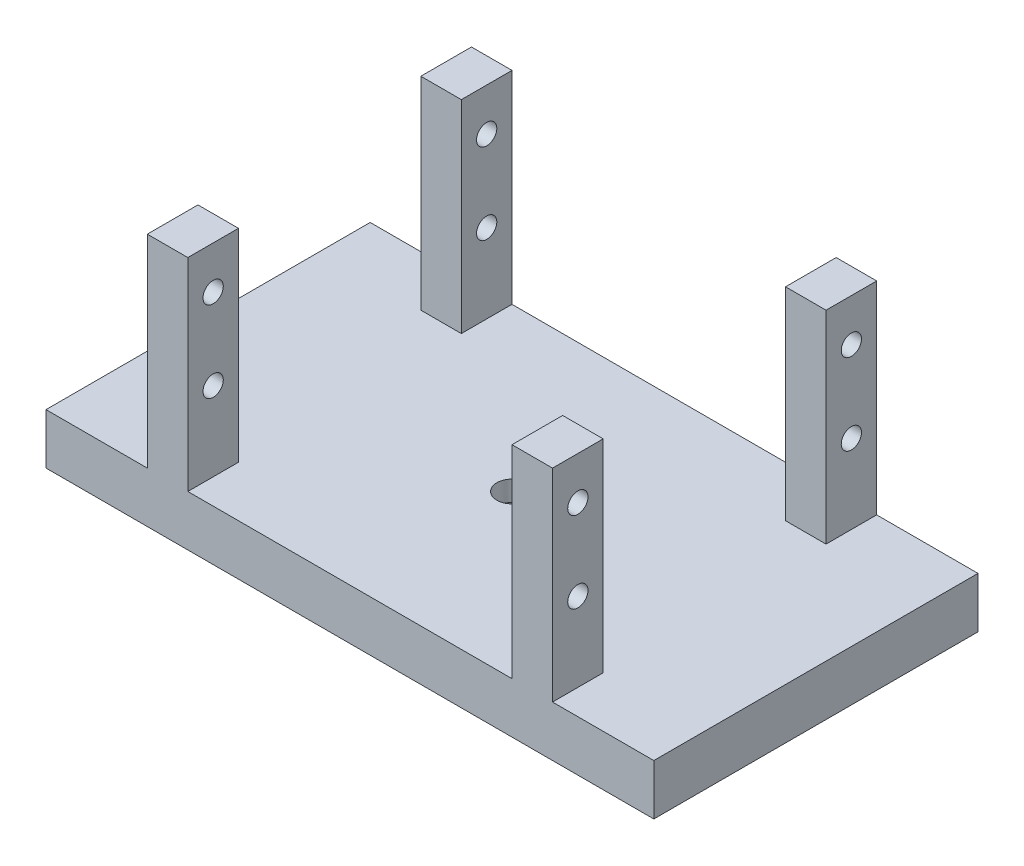
ISO-10303-21;
HEADER;
FILE_DESCRIPTION(('STEP AP214'),'2;1');
FILE_NAME('part.step','',(''),(''),'','','');
FILE_SCHEMA(('AUTOMOTIVE_DESIGN { 1 0 10303 214 1 1 1 1 }'));
ENDSEC;
DATA;
#1=APPLICATION_CONTEXT('core data for automotive mechanical design processes');
#2=APPLICATION_PROTOCOL_DEFINITION('international standard','automotive_design',2000,#1);
#3=PRODUCT_CONTEXT('',#1,'mechanical');
#4=PRODUCT('Part','Part','',(#3));
#5=PRODUCT_RELATED_PRODUCT_CATEGORY('part','',(#4));
#6=PRODUCT_DEFINITION_FORMATION('','',#4);
#7=PRODUCT_DEFINITION_CONTEXT('part definition',#1,'design');
#8=PRODUCT_DEFINITION('design','',#6,#7);
#9=PRODUCT_DEFINITION_SHAPE('','',#8);
#10=(LENGTH_UNIT() NAMED_UNIT(*) SI_UNIT(.MILLI.,.METRE.));
#11=(NAMED_UNIT(*) PLANE_ANGLE_UNIT() SI_UNIT($,.RADIAN.));
#12=(NAMED_UNIT(*) SI_UNIT($,.STERADIAN.) SOLID_ANGLE_UNIT());
#13=UNCERTAINTY_MEASURE_WITH_UNIT(LENGTH_MEASURE(1.E-05),#10,'distance_accuracy_value','');
#14=(GEOMETRIC_REPRESENTATION_CONTEXT(3) GLOBAL_UNCERTAINTY_ASSIGNED_CONTEXT((#13)) GLOBAL_UNIT_ASSIGNED_CONTEXT((#10,
#11,#12)) REPRESENTATION_CONTEXT('',''));
#15=CARTESIAN_POINT('',(0.,0.,0.));
#16=DIRECTION('',(0.,0.,1.));
#17=DIRECTION('',(1.,0.,0.));
#18=AXIS2_PLACEMENT_3D('',#15,#16,#17);
#19=CARTESIAN_POINT('',(-16.,25.,-16.));
#20=DIRECTION('',(-1.,0.,0.));
#21=DIRECTION('',(0.,0.,1.));
#22=AXIS2_PLACEMENT_3D('',#19,#20,#21);
#23=PLANE('',#22);
#24=CARTESIAN_POINT('',(-16.,20.8,13.5));
#25=DIRECTION('',(-1.,0.,0.));
#26=DIRECTION('',(0.,0.,1.));
#27=AXIS2_PLACEMENT_3D('',#24,#25,#26);
#28=CIRCLE('',#27,1.);
#29=CARTESIAN_POINT('',(-16.,20.8,14.5));
#30=VERTEX_POINT('',#29);
#31=EDGE_CURVE('E322',#30,#30,#28,.T.);
#32=ORIENTED_EDGE('',*,*,#31,.T.);
#33=EDGE_LOOP('',(#32));
#34=FACE_BOUND('',#33,.T.);
#35=CARTESIAN_POINT('',(-16.,12.8,13.5));
#36=DIRECTION('',(-1.,0.,0.));
#37=DIRECTION('',(0.,0.,1.));
#38=AXIS2_PLACEMENT_3D('',#35,#36,#37);
#39=CIRCLE('',#38,1.);
#40=CARTESIAN_POINT('',(-16.,12.8,14.5));
#41=VERTEX_POINT('',#40);
#42=EDGE_CURVE('E316',#41,#41,#39,.T.);
#43=ORIENTED_EDGE('',*,*,#42,.T.);
#44=EDGE_LOOP('',(#43));
#45=FACE_BOUND('',#44,.T.);
#46=DIRECTION('',(0.,0.,-1.));
#47=VECTOR('',#46,1.);
#48=CARTESIAN_POINT('',(-16.,5.,-16.));
#49=LINE('',#48,#47);
#50=CARTESIAN_POINT('',(-16.,5.,16.));
#51=VERTEX_POINT('',#50);
#52=CARTESIAN_POINT('',(-16.,5.,11.));
#53=VERTEX_POINT('',#52);
#54=EDGE_CURVE('E213',#51,#53,#49,.T.);
#55=ORIENTED_EDGE('',*,*,#54,.T.);
#56=DIRECTION('',(0.,1.,0.));
#57=VECTOR('',#56,1.);
#58=CARTESIAN_POINT('',(-16.,25.,11.));
#59=LINE('',#58,#57);
#60=CARTESIAN_POINT('',(-16.,25.,11.));
#61=VERTEX_POINT('',#60);
#62=EDGE_CURVE('E188',#53,#61,#59,.T.);
#63=ORIENTED_EDGE('',*,*,#62,.T.);
#64=DIRECTION('',(0.,0.,-1.));
#65=VECTOR('',#64,1.);
#66=CARTESIAN_POINT('',(-16.,25.,-16.));
#67=LINE('',#66,#65);
#68=CARTESIAN_POINT('',(-16.,25.,16.));
#69=VERTEX_POINT('',#68);
#70=EDGE_CURVE('E386',#69,#61,#67,.T.);
#71=ORIENTED_EDGE('',*,*,#70,.F.);
#72=DIRECTION('',(0.,-1.,0.));
#73=VECTOR('',#72,1.);
#74=CARTESIAN_POINT('',(-16.,25.,16.));
#75=LINE('',#74,#73);
#76=EDGE_CURVE('E223',#69,#51,#75,.T.);
#77=ORIENTED_EDGE('',*,*,#76,.T.);
#78=EDGE_LOOP('',(#55,#63,#71,#77));
#79=FACE_BOUND('',#78,.T.);
#80=ADVANCED_FACE('F43',(#34,#45,#79),#23,.F.);
#81=CARTESIAN_POINT('',(-20.,25.,-16.));
#82=DIRECTION('',(1.,0.,0.));
#83=DIRECTION('',(0.,0.,-1.));
#84=AXIS2_PLACEMENT_3D('',#81,#82,#83);
#85=PLANE('',#84);
#86=CARTESIAN_POINT('',(-20.,20.8,13.5));
#87=DIRECTION('',(-1.,0.,0.));
#88=DIRECTION('',(0.,0.,1.));
#89=AXIS2_PLACEMENT_3D('',#86,#87,#88);
#90=CIRCLE('',#89,1.);
#91=CARTESIAN_POINT('',(-20.,20.8,14.5));
#92=VERTEX_POINT('',#91);
#93=EDGE_CURVE('E593',#92,#92,#90,.T.);
#94=ORIENTED_EDGE('',*,*,#93,.F.);
#95=EDGE_LOOP('',(#94));
#96=FACE_BOUND('',#95,.T.);
#97=CARTESIAN_POINT('',(-20.,12.8,13.5));
#98=DIRECTION('',(-1.,0.,0.));
#99=DIRECTION('',(0.,0.,1.));
#100=AXIS2_PLACEMENT_3D('',#97,#98,#99);
#101=CIRCLE('',#100,1.);
#102=CARTESIAN_POINT('',(-20.,12.8,14.5));
#103=VERTEX_POINT('',#102);
#104=EDGE_CURVE('E203',#103,#103,#101,.T.);
#105=ORIENTED_EDGE('',*,*,#104,.F.);
#106=EDGE_LOOP('',(#105));
#107=FACE_BOUND('',#106,.T.);
#108=DIRECTION('',(0.,0.,1.));
#109=VECTOR('',#108,1.);
#110=CARTESIAN_POINT('',(-20.,25.,-16.));
#111=LINE('',#110,#109);
#112=CARTESIAN_POINT('',(-20.,25.,11.));
#113=VERTEX_POINT('',#112);
#114=CARTESIAN_POINT('',(-20.,25.,16.));
#115=VERTEX_POINT('',#114);
#116=EDGE_CURVE('E201',#113,#115,#111,.T.);
#117=ORIENTED_EDGE('',*,*,#116,.F.);
#118=DIRECTION('',(0.,1.,0.));
#119=VECTOR('',#118,1.);
#120=CARTESIAN_POINT('',(-20.,25.,11.));
#121=LINE('',#120,#119);
#122=CARTESIAN_POINT('',(-20.,5.,11.));
#123=VERTEX_POINT('',#122);
#124=EDGE_CURVE('E185',#123,#113,#121,.T.);
#125=ORIENTED_EDGE('',*,*,#124,.F.);
#126=DIRECTION('',(0.,0.,1.));
#127=VECTOR('',#126,1.);
#128=CARTESIAN_POINT('',(-20.,5.,-16.));
#129=LINE('',#128,#127);
#130=CARTESIAN_POINT('',(-20.,5.,16.));
#131=VERTEX_POINT('',#130);
#132=EDGE_CURVE('E199',#123,#131,#129,.T.);
#133=ORIENTED_EDGE('',*,*,#132,.T.);
#134=DIRECTION('',(0.,-1.,0.));
#135=VECTOR('',#134,1.);
#136=CARTESIAN_POINT('',(-20.,25.,16.));
#137=LINE('',#136,#135);
#138=EDGE_CURVE('E227',#115,#131,#137,.T.);
#139=ORIENTED_EDGE('',*,*,#138,.F.);
#140=EDGE_LOOP('',(#117,#125,#133,#139));
#141=FACE_BOUND('',#140,.T.);
#142=ADVANCED_FACE('F197',(#96,#107,#141),#85,.F.);
#143=CARTESIAN_POINT('',(0.,25.,0.));
#144=DIRECTION('',(0.,1.,0.));
#145=DIRECTION('',(0.,0.,1.));
#146=AXIS2_PLACEMENT_3D('',#143,#144,#145);
#147=PLANE('',#146);
#148=DIRECTION('',(-1.,0.,0.));
#149=VECTOR('',#148,1.);
#150=CARTESIAN_POINT('',(30.,25.,11.));
#151=LINE('',#150,#149);
#152=EDGE_CURVE('E577',#61,#113,#151,.T.);
#153=ORIENTED_EDGE('',*,*,#152,.T.);
#154=ORIENTED_EDGE('',*,*,#116,.T.);
#155=DIRECTION('',(1.,0.,0.));
#156=VECTOR('',#155,1.);
#157=CARTESIAN_POINT('',(-20.,25.,16.));
#158=LINE('',#157,#156);
#159=EDGE_CURVE('E228',#115,#69,#158,.T.);
#160=ORIENTED_EDGE('',*,*,#159,.T.);
#161=ORIENTED_EDGE('',*,*,#70,.T.);
#162=EDGE_LOOP('',(#153,#154,#160,#161));
#163=FACE_BOUND('',#162,.T.);
#164=ADVANCED_FACE('F400',(#163),#147,.T.);
#165=CARTESIAN_POINT('',(20.,25.,-16.));
#166=DIRECTION('',(-1.,0.,0.));
#167=DIRECTION('',(0.,0.,1.));
#168=AXIS2_PLACEMENT_3D('',#165,#166,#167);
#169=PLANE('',#168);
#170=CARTESIAN_POINT('',(20.,20.8,13.5));
#171=DIRECTION('',(-1.,0.,0.));
#172=DIRECTION('',(0.,0.,1.));
#173=AXIS2_PLACEMENT_3D('',#170,#171,#172);
#174=CIRCLE('',#173,1.);
#175=CARTESIAN_POINT('',(20.,20.8,14.5));
#176=VERTEX_POINT('',#175);
#177=EDGE_CURVE('E315',#176,#176,#174,.T.);
#178=ORIENTED_EDGE('',*,*,#177,.T.);
#179=EDGE_LOOP('',(#178));
#180=FACE_BOUND('',#179,.T.);
#181=CARTESIAN_POINT('',(20.,12.8,13.5));
#182=DIRECTION('',(-1.,0.,0.));
#183=DIRECTION('',(0.,0.,1.));
#184=AXIS2_PLACEMENT_3D('',#181,#182,#183);
#185=CIRCLE('',#184,1.);
#186=CARTESIAN_POINT('',(20.,12.8,14.5));
#187=VERTEX_POINT('',#186);
#188=EDGE_CURVE('E310',#187,#187,#185,.T.);
#189=ORIENTED_EDGE('',*,*,#188,.T.);
#190=EDGE_LOOP('',(#189));
#191=FACE_BOUND('',#190,.T.);
#192=DIRECTION('',(0.,0.,-1.));
#193=VECTOR('',#192,1.);
#194=CARTESIAN_POINT('',(20.,5.,-16.));
#195=LINE('',#194,#193);
#196=CARTESIAN_POINT('',(20.,5.,16.));
#197=VERTEX_POINT('',#196);
#198=CARTESIAN_POINT('',(20.,5.,11.));
#199=VERTEX_POINT('',#198);
#200=EDGE_CURVE('E367',#197,#199,#195,.T.);
#201=ORIENTED_EDGE('',*,*,#200,.T.);
#202=DIRECTION('',(0.,1.,0.));
#203=VECTOR('',#202,1.);
#204=CARTESIAN_POINT('',(20.,25.,11.));
#205=LINE('',#204,#203);
#206=CARTESIAN_POINT('',(20.,25.,11.));
#207=VERTEX_POINT('',#206);
#208=EDGE_CURVE('E408',#199,#207,#205,.T.);
#209=ORIENTED_EDGE('',*,*,#208,.T.);
#210=DIRECTION('',(0.,0.,-1.));
#211=VECTOR('',#210,1.);
#212=CARTESIAN_POINT('',(20.,25.,-16.));
#213=LINE('',#212,#211);
#214=CARTESIAN_POINT('',(20.,25.,16.));
#215=VERTEX_POINT('',#214);
#216=EDGE_CURVE('E382',#215,#207,#213,.T.);
#217=ORIENTED_EDGE('',*,*,#216,.F.);
#218=DIRECTION('',(0.,-1.,0.));
#219=VECTOR('',#218,1.);
#220=CARTESIAN_POINT('',(20.,25.,16.));
#221=LINE('',#220,#219);
#222=EDGE_CURVE('E356',#215,#197,#221,.T.);
#223=ORIENTED_EDGE('',*,*,#222,.T.);
#224=EDGE_LOOP('',(#201,#209,#217,#223));
#225=FACE_BOUND('',#224,.T.);
#226=ADVANCED_FACE('F499',(#180,#191,#225),#169,.F.);
#227=CARTESIAN_POINT('',(16.,25.,-16.));
#228=DIRECTION('',(1.,0.,0.));
#229=DIRECTION('',(0.,0.,-1.));
#230=AXIS2_PLACEMENT_3D('',#227,#228,#229);
#231=PLANE('',#230);
#232=CARTESIAN_POINT('',(16.,20.8,13.5));
#233=DIRECTION('',(1.,0.,0.));
#234=DIRECTION('',(0.,0.,-1.));
#235=AXIS2_PLACEMENT_3D('',#232,#233,#234);
#236=CIRCLE('',#235,1.);
#237=CARTESIAN_POINT('',(16.,20.8,12.5));
#238=VERTEX_POINT('',#237);
#239=EDGE_CURVE('E312',#238,#238,#236,.T.);
#240=ORIENTED_EDGE('',*,*,#239,.T.);
#241=EDGE_LOOP('',(#240));
#242=FACE_BOUND('',#241,.T.);
#243=CARTESIAN_POINT('',(16.,12.8,13.5));
#244=DIRECTION('',(1.,0.,0.));
#245=DIRECTION('',(0.,0.,-1.));
#246=AXIS2_PLACEMENT_3D('',#243,#244,#245);
#247=CIRCLE('',#246,1.);
#248=CARTESIAN_POINT('',(16.,12.8,12.5));
#249=VERTEX_POINT('',#248);
#250=EDGE_CURVE('E307',#249,#249,#247,.T.);
#251=ORIENTED_EDGE('',*,*,#250,.T.);
#252=EDGE_LOOP('',(#251));
#253=FACE_BOUND('',#252,.T.);
#254=DIRECTION('',(0.,0.,1.));
#255=VECTOR('',#254,1.);
#256=CARTESIAN_POINT('',(16.,25.,-16.));
#257=LINE('',#256,#255);
#258=CARTESIAN_POINT('',(16.,25.,11.));
#259=VERTEX_POINT('',#258);
#260=CARTESIAN_POINT('',(16.,25.,16.));
#261=VERTEX_POINT('',#260);
#262=EDGE_CURVE('E373',#259,#261,#257,.T.);
#263=ORIENTED_EDGE('',*,*,#262,.F.);
#264=DIRECTION('',(0.,-1.,0.));
#265=VECTOR('',#264,1.);
#266=CARTESIAN_POINT('',(16.,25.,11.));
#267=LINE('',#266,#265);
#268=CARTESIAN_POINT('',(16.,5.,11.));
#269=VERTEX_POINT('',#268);
#270=EDGE_CURVE('E412',#259,#269,#267,.T.);
#271=ORIENTED_EDGE('',*,*,#270,.T.);
#272=DIRECTION('',(0.,0.,1.));
#273=VECTOR('',#272,1.);
#274=CARTESIAN_POINT('',(16.,5.,-16.));
#275=LINE('',#274,#273);
#276=CARTESIAN_POINT('',(16.,5.,16.));
#277=VERTEX_POINT('',#276);
#278=EDGE_CURVE('E366',#269,#277,#275,.T.);
#279=ORIENTED_EDGE('',*,*,#278,.T.);
#280=DIRECTION('',(0.,-1.,0.));
#281=VECTOR('',#280,1.);
#282=CARTESIAN_POINT('',(16.,25.,16.));
#283=LINE('',#282,#281);
#284=EDGE_CURVE('E352',#261,#277,#283,.T.);
#285=ORIENTED_EDGE('',*,*,#284,.F.);
#286=EDGE_LOOP('',(#263,#271,#279,#285));
#287=FACE_BOUND('',#286,.T.);
#288=ADVANCED_FACE('F516',(#242,#253,#287),#231,.F.);
#289=CARTESIAN_POINT('',(0.,25.,0.));
#290=DIRECTION('',(0.,-1.,0.));
#291=DIRECTION('',(0.,0.,-1.));
#292=AXIS2_PLACEMENT_3D('',#289,#290,#291);
#293=PLANE('',#292);
#294=ORIENTED_EDGE('',*,*,#216,.T.);
#295=DIRECTION('',(-1.,0.,0.));
#296=VECTOR('',#295,1.);
#297=CARTESIAN_POINT('',(0.,25.,11.));
#298=LINE('',#297,#296);
#299=EDGE_CURVE('E11',#207,#259,#298,.T.);
#300=ORIENTED_EDGE('',*,*,#299,.T.);
#301=ORIENTED_EDGE('',*,*,#262,.T.);
#302=DIRECTION('',(1.,0.,0.));
#303=VECTOR('',#302,1.);
#304=CARTESIAN_POINT('',(20.,25.,16.));
#305=LINE('',#304,#303);
#306=EDGE_CURVE('E360',#261,#215,#305,.T.);
#307=ORIENTED_EDGE('',*,*,#306,.T.);
#308=EDGE_LOOP('',(#294,#300,#301,#307));
#309=FACE_BOUND('',#308,.T.);
#310=ADVANCED_FACE('F559',(#309),#293,.F.);
#311=CARTESIAN_POINT('',(0.,5.,0.));
#312=DIRECTION('',(0.,-1.,0.));
#313=DIRECTION('',(0.,0.,-1.));
#314=AXIS2_PLACEMENT_3D('',#311,#312,#313);
#315=CYLINDRICAL_SURFACE('',#314,1.5);
#316=CARTESIAN_POINT('',(0.,5.,0.));
#317=DIRECTION('',(0.,1.,0.));
#318=DIRECTION('',(0.,0.,1.));
#319=AXIS2_PLACEMENT_3D('',#316,#317,#318);
#320=CIRCLE('',#319,1.5);
#321=CARTESIAN_POINT('',(0.,5.,1.5));
#322=VERTEX_POINT('',#321);
#323=EDGE_CURVE('E248',#322,#322,#320,.T.);
#324=ORIENTED_EDGE('',*,*,#323,.T.);
#325=EDGE_LOOP('',(#324));
#326=FACE_BOUND('',#325,.T.);
#327=CARTESIAN_POINT('',(0.,3.,0.));
#328=DIRECTION('',(0.,-1.,0.));
#329=DIRECTION('',(0.,0.,-1.));
#330=AXIS2_PLACEMENT_3D('',#327,#328,#329);
#331=CIRCLE('',#330,1.5);
#332=CARTESIAN_POINT('',(0.,3.,-1.5));
#333=VERTEX_POINT('',#332);
#334=EDGE_CURVE('E244',#333,#333,#331,.T.);
#335=ORIENTED_EDGE('',*,*,#334,.T.);
#336=EDGE_LOOP('',(#335));
#337=FACE_BOUND('',#336,.T.);
#338=ADVANCED_FACE('F628',(#326,#337),#315,.F.);
#339=CARTESIAN_POINT('',(0.,5.,0.));
#340=DIRECTION('',(0.,1.,0.));
#341=DIRECTION('',(0.,0.,1.));
#342=AXIS2_PLACEMENT_3D('',#339,#340,#341);
#343=PLANE('',#342);
#344=CARTESIAN_POINT('',(-20.,5.,-16.));
#345=VERTEX_POINT('',#344);
#346=CARTESIAN_POINT('',(-20.,5.,-11.));
#347=VERTEX_POINT('',#346);
#348=EDGE_CURVE('E212',#345,#347,#129,.T.);
#349=ORIENTED_EDGE('',*,*,#348,.F.);
#350=DIRECTION('',(-1.,0.,0.));
#351=VECTOR('',#350,1.);
#352=CARTESIAN_POINT('',(-30.,5.,-16.));
#353=LINE('',#352,#351);
#354=CARTESIAN_POINT('',(-30.,5.,-16.));
#355=VERTEX_POINT('',#354);
#356=EDGE_CURVE('E256',#345,#355,#353,.T.);
#357=ORIENTED_EDGE('',*,*,#356,.T.);
#358=DIRECTION('',(0.,0.,1.));
#359=VECTOR('',#358,1.);
#360=CARTESIAN_POINT('',(-30.,5.,-16.));
#361=LINE('',#360,#359);
#362=CARTESIAN_POINT('',(-30.,5.,16.));
#363=VERTEX_POINT('',#362);
#364=EDGE_CURVE('E262',#355,#363,#361,.T.);
#365=ORIENTED_EDGE('',*,*,#364,.T.);
#366=DIRECTION('',(1.,0.,0.));
#367=VECTOR('',#366,1.);
#368=CARTESIAN_POINT('',(-30.,5.,16.));
#369=LINE('',#368,#367);
#370=EDGE_CURVE('E209',#363,#131,#369,.T.);
#371=ORIENTED_EDGE('',*,*,#370,.T.);
#372=ORIENTED_EDGE('',*,*,#132,.F.);
#373=DIRECTION('',(-1.,0.,0.));
#374=VECTOR('',#373,1.);
#375=CARTESIAN_POINT('',(30.,5.,11.));
#376=LINE('',#375,#374);
#377=EDGE_CURVE('E182',#53,#123,#376,.T.);
#378=ORIENTED_EDGE('',*,*,#377,.F.);
#379=ORIENTED_EDGE('',*,*,#54,.F.);
#380=EDGE_CURVE('E270',#51,#277,#369,.T.);
#381=ORIENTED_EDGE('',*,*,#380,.T.);
#382=ORIENTED_EDGE('',*,*,#278,.F.);
#383=EDGE_CURVE('E193',#199,#269,#376,.T.);
#384=ORIENTED_EDGE('',*,*,#383,.F.);
#385=ORIENTED_EDGE('',*,*,#200,.F.);
#386=CARTESIAN_POINT('',(30.,5.,16.));
#387=VERTEX_POINT('',#386);
#388=EDGE_CURVE('E266',#197,#387,#369,.T.);
#389=ORIENTED_EDGE('',*,*,#388,.T.);
#390=DIRECTION('',(0.,0.,-1.));
#391=VECTOR('',#390,1.);
#392=CARTESIAN_POINT('',(30.,5.,-16.));
#393=LINE('',#392,#391);
#394=CARTESIAN_POINT('',(30.,5.,-16.));
#395=VERTEX_POINT('',#394);
#396=EDGE_CURVE('E253',#387,#395,#393,.T.);
#397=ORIENTED_EDGE('',*,*,#396,.T.);
#398=CARTESIAN_POINT('',(20.,5.,-16.));
#399=VERTEX_POINT('',#398);
#400=EDGE_CURVE('E258',#395,#399,#353,.T.);
#401=ORIENTED_EDGE('',*,*,#400,.T.);
#402=CARTESIAN_POINT('',(20.,5.,-11.));
#403=VERTEX_POINT('',#402);
#404=EDGE_CURVE('E365',#403,#399,#195,.T.);
#405=ORIENTED_EDGE('',*,*,#404,.F.);
#406=DIRECTION('',(-1.,0.,0.));
#407=VECTOR('',#406,1.);
#408=CARTESIAN_POINT('',(30.,5.,-11.));
#409=LINE('',#408,#407);
#410=CARTESIAN_POINT('',(16.,5.,-11.));
#411=VERTEX_POINT('',#410);
#412=EDGE_CURVE('E527',#403,#411,#409,.T.);
#413=ORIENTED_EDGE('',*,*,#412,.T.);
#414=CARTESIAN_POINT('',(16.,5.,-16.));
#415=VERTEX_POINT('',#414);
#416=EDGE_CURVE('E361',#415,#411,#275,.T.);
#417=ORIENTED_EDGE('',*,*,#416,.F.);
#418=CARTESIAN_POINT('',(-16.,5.,-16.));
#419=VERTEX_POINT('',#418);
#420=EDGE_CURVE('E263',#415,#419,#353,.T.);
#421=ORIENTED_EDGE('',*,*,#420,.T.);
#422=CARTESIAN_POINT('',(-16.,5.,-11.));
#423=VERTEX_POINT('',#422);
#424=EDGE_CURVE('E219',#423,#419,#49,.T.);
#425=ORIENTED_EDGE('',*,*,#424,.F.);
#426=EDGE_CURVE('E568',#423,#347,#409,.T.);
#427=ORIENTED_EDGE('',*,*,#426,.T.);
#428=EDGE_LOOP('',(#349,#357,#365,#371,#372,#378,#379,#381,#382,#384,#385,#389,#397,#401,#405,
#413,#417,#421,#425,#427));
#429=FACE_BOUND('',#428,.T.);
#430=ORIENTED_EDGE('',*,*,#323,.F.);
#431=EDGE_LOOP('',(#430));
#432=FACE_BOUND('',#431,.T.);
#433=ADVANCED_FACE('F206',(#429,#432),#343,.T.);
#434=CARTESIAN_POINT('',(0.,0.,0.));
#435=DIRECTION('',(0.,1.,0.));
#436=DIRECTION('',(0.,0.,1.));
#437=AXIS2_PLACEMENT_3D('',#434,#435,#436);
#438=PLANE('',#437);
#439=CARTESIAN_POINT('',(0.,0.,0.));
#440=DIRECTION('',(0.,-1.,0.));
#441=DIRECTION('',(0.,0.,-1.));
#442=AXIS2_PLACEMENT_3D('',#439,#440,#441);
#443=CIRCLE('',#442,4.);
#444=CARTESIAN_POINT('',(0.,0.,-4.));
#445=VERTEX_POINT('',#444);
#446=EDGE_CURVE('E239',#445,#445,#443,.T.);
#447=ORIENTED_EDGE('',*,*,#446,.F.);
#448=EDGE_LOOP('',(#447));
#449=FACE_BOUND('',#448,.T.);
#450=DIRECTION('',(0.,0.,-1.));
#451=VECTOR('',#450,1.);
#452=CARTESIAN_POINT('',(30.,0.,-16.));
#453=LINE('',#452,#451);
#454=CARTESIAN_POINT('',(30.,0.,16.));
#455=VERTEX_POINT('',#454);
#456=CARTESIAN_POINT('',(30.,0.,-16.));
#457=VERTEX_POINT('',#456);
#458=EDGE_CURVE('E252',#455,#457,#453,.T.);
#459=ORIENTED_EDGE('',*,*,#458,.F.);
#460=DIRECTION('',(1.,0.,0.));
#461=VECTOR('',#460,1.);
#462=CARTESIAN_POINT('',(-30.,0.,16.));
#463=LINE('',#462,#461);
#464=CARTESIAN_POINT('',(-30.,0.,16.));
#465=VERTEX_POINT('',#464);
#466=EDGE_CURVE('E257',#465,#455,#463,.T.);
#467=ORIENTED_EDGE('',*,*,#466,.F.);
#468=DIRECTION('',(0.,0.,1.));
#469=VECTOR('',#468,1.);
#470=CARTESIAN_POINT('',(-30.,0.,-16.));
#471=LINE('',#470,#469);
#472=CARTESIAN_POINT('',(-30.,0.,-16.));
#473=VERTEX_POINT('',#472);
#474=EDGE_CURVE('E277',#473,#465,#471,.T.);
#475=ORIENTED_EDGE('',*,*,#474,.F.);
#476=DIRECTION('',(-1.,0.,0.));
#477=VECTOR('',#476,1.);
#478=CARTESIAN_POINT('',(-30.,0.,-16.));
#479=LINE('',#478,#477);
#480=EDGE_CURVE('E274',#457,#473,#479,.T.);
#481=ORIENTED_EDGE('',*,*,#480,.F.);
#482=EDGE_LOOP('',(#459,#467,#475,#481));
#483=FACE_BOUND('',#482,.T.);
#484=ADVANCED_FACE('F546',(#449,#483),#438,.F.);
#485=CARTESIAN_POINT('',(30.,5.,-16.));
#486=DIRECTION('',(-1.,0.,0.));
#487=DIRECTION('',(0.,0.,1.));
#488=AXIS2_PLACEMENT_3D('',#485,#486,#487);
#489=PLANE('',#488);
#490=ORIENTED_EDGE('',*,*,#458,.T.);
#491=DIRECTION('',(0.,-1.,0.));
#492=VECTOR('',#491,1.);
#493=CARTESIAN_POINT('',(30.,5.,-16.));
#494=LINE('',#493,#492);
#495=EDGE_CURVE('E293',#395,#457,#494,.T.);
#496=ORIENTED_EDGE('',*,*,#495,.F.);
#497=ORIENTED_EDGE('',*,*,#396,.F.);
#498=DIRECTION('',(0.,-1.,0.));
#499=VECTOR('',#498,1.);
#500=CARTESIAN_POINT('',(30.,5.,16.));
#501=LINE('',#500,#499);
#502=EDGE_CURVE('E269',#387,#455,#501,.T.);
#503=ORIENTED_EDGE('',*,*,#502,.T.);
#504=EDGE_LOOP('',(#490,#496,#497,#503));
#505=FACE_BOUND('',#504,.T.);
#506=ADVANCED_FACE('F45',(#505),#489,.F.);
#507=CARTESIAN_POINT('',(-30.,5.,-16.));
#508=DIRECTION('',(0.,0.,1.));
#509=DIRECTION('',(1.,0.,0.));
#510=AXIS2_PLACEMENT_3D('',#507,#508,#509);
#511=PLANE('',#510);
#512=ORIENTED_EDGE('',*,*,#480,.T.);
#513=DIRECTION('',(0.,-1.,0.));
#514=VECTOR('',#513,1.);
#515=CARTESIAN_POINT('',(-30.,5.,-16.));
#516=LINE('',#515,#514);
#517=EDGE_CURVE('E289',#355,#473,#516,.T.);
#518=ORIENTED_EDGE('',*,*,#517,.F.);
#519=ORIENTED_EDGE('',*,*,#356,.F.);
#520=DIRECTION('',(0.,-1.,0.));
#521=VECTOR('',#520,1.);
#522=CARTESIAN_POINT('',(-20.,25.,-16.));
#523=LINE('',#522,#521);
#524=CARTESIAN_POINT('',(-20.,25.,-16.));
#525=VERTEX_POINT('',#524);
#526=EDGE_CURVE('E231',#525,#345,#523,.T.);
#527=ORIENTED_EDGE('',*,*,#526,.F.);
#528=DIRECTION('',(-1.,0.,0.));
#529=VECTOR('',#528,1.);
#530=CARTESIAN_POINT('',(-20.,25.,-16.));
#531=LINE('',#530,#529);
#532=CARTESIAN_POINT('',(-16.,25.,-16.));
#533=VERTEX_POINT('',#532);
#534=EDGE_CURVE('E390',#533,#525,#531,.T.);
#535=ORIENTED_EDGE('',*,*,#534,.F.);
#536=DIRECTION('',(0.,-1.,0.));
#537=VECTOR('',#536,1.);
#538=CARTESIAN_POINT('',(-16.,25.,-16.));
#539=LINE('',#538,#537);
#540=EDGE_CURVE('E235',#533,#419,#539,.T.);
#541=ORIENTED_EDGE('',*,*,#540,.T.);
#542=ORIENTED_EDGE('',*,*,#420,.F.);
#543=DIRECTION('',(0.,-1.,0.));
#544=VECTOR('',#543,1.);
#545=CARTESIAN_POINT('',(16.,25.,-16.));
#546=LINE('',#545,#544);
#547=CARTESIAN_POINT('',(16.,25.,-16.));
#548=VERTEX_POINT('',#547);
#549=EDGE_CURVE('E348',#548,#415,#546,.T.);
#550=ORIENTED_EDGE('',*,*,#549,.F.);
#551=DIRECTION('',(-1.,0.,0.));
#552=VECTOR('',#551,1.);
#553=CARTESIAN_POINT('',(20.,25.,-16.));
#554=LINE('',#553,#552);
#555=CARTESIAN_POINT('',(20.,25.,-16.));
#556=VERTEX_POINT('',#555);
#557=EDGE_CURVE('E378',#556,#548,#554,.T.);
#558=ORIENTED_EDGE('',*,*,#557,.F.);
#559=DIRECTION('',(0.,-1.,0.));
#560=VECTOR('',#559,1.);
#561=CARTESIAN_POINT('',(20.,25.,-16.));
#562=LINE('',#561,#560);
#563=EDGE_CURVE('E344',#556,#399,#562,.T.);
#564=ORIENTED_EDGE('',*,*,#563,.T.);
#565=ORIENTED_EDGE('',*,*,#400,.F.);
#566=ORIENTED_EDGE('',*,*,#495,.T.);
#567=EDGE_LOOP('',(#512,#518,#519,#527,#535,#541,#542,#550,#558,#564,#565,#566));
#568=FACE_BOUND('',#567,.T.);
#569=ADVANCED_FACE('F529',(#568),#511,.F.);
#570=CARTESIAN_POINT('',(-30.,5.,-16.));
#571=DIRECTION('',(1.,0.,0.));
#572=DIRECTION('',(0.,0.,-1.));
#573=AXIS2_PLACEMENT_3D('',#570,#571,#572);
#574=PLANE('',#573);
#575=ORIENTED_EDGE('',*,*,#474,.T.);
#576=DIRECTION('',(0.,-1.,0.));
#577=VECTOR('',#576,1.);
#578=CARTESIAN_POINT('',(-30.,5.,16.));
#579=LINE('',#578,#577);
#580=EDGE_CURVE('E285',#363,#465,#579,.T.);
#581=ORIENTED_EDGE('',*,*,#580,.F.);
#582=ORIENTED_EDGE('',*,*,#364,.F.);
#583=ORIENTED_EDGE('',*,*,#517,.T.);
#584=EDGE_LOOP('',(#575,#581,#582,#583));
#585=FACE_BOUND('',#584,.T.);
#586=ADVANCED_FACE('F541',(#585),#574,.F.);
#587=CARTESIAN_POINT('',(-30.,5.,16.));
#588=DIRECTION('',(0.,0.,-1.));
#589=DIRECTION('',(-1.,0.,0.));
#590=AXIS2_PLACEMENT_3D('',#587,#588,#589);
#591=PLANE('',#590);
#592=ORIENTED_EDGE('',*,*,#466,.T.);
#593=ORIENTED_EDGE('',*,*,#502,.F.);
#594=ORIENTED_EDGE('',*,*,#388,.F.);
#595=ORIENTED_EDGE('',*,*,#222,.F.);
#596=ORIENTED_EDGE('',*,*,#306,.F.);
#597=ORIENTED_EDGE('',*,*,#284,.T.);
#598=ORIENTED_EDGE('',*,*,#380,.F.);
#599=ORIENTED_EDGE('',*,*,#76,.F.);
#600=ORIENTED_EDGE('',*,*,#159,.F.);
#601=ORIENTED_EDGE('',*,*,#138,.T.);
#602=ORIENTED_EDGE('',*,*,#370,.F.);
#603=ORIENTED_EDGE('',*,*,#580,.T.);
#604=EDGE_LOOP('',(#592,#593,#594,#595,#596,#597,#598,#599,#600,#601,#602,#603));
#605=FACE_BOUND('',#604,.T.);
#606=ADVANCED_FACE('F404',(#605),#591,.F.);
#607=CARTESIAN_POINT('',(0.,3.,0.));
#608=DIRECTION('',(0.,-1.,0.));
#609=DIRECTION('',(0.,0.,-1.));
#610=AXIS2_PLACEMENT_3D('',#607,#608,#609);
#611=CYLINDRICAL_SURFACE('',#610,4.);
#612=CARTESIAN_POINT('',(0.,3.,0.));
#613=DIRECTION('',(0.,-1.,0.));
#614=DIRECTION('',(0.,0.,-1.));
#615=AXIS2_PLACEMENT_3D('',#612,#613,#614);
#616=CIRCLE('',#615,4.);
#617=CARTESIAN_POINT('',(0.,3.,-4.));
#618=VERTEX_POINT('',#617);
#619=EDGE_CURVE('E240',#618,#618,#616,.T.);
#620=ORIENTED_EDGE('',*,*,#619,.F.);
#621=EDGE_LOOP('',(#620));
#622=FACE_BOUND('',#621,.T.);
#623=ORIENTED_EDGE('',*,*,#446,.T.);
#624=EDGE_LOOP('',(#623));
#625=FACE_BOUND('',#624,.T.);
#626=ADVANCED_FACE('F466',(#622,#625),#611,.F.);
#627=CARTESIAN_POINT('',(0.,3.,0.));
#628=DIRECTION('',(0.,-1.,0.));
#629=DIRECTION('',(0.,0.,-1.));
#630=AXIS2_PLACEMENT_3D('',#627,#628,#629);
#631=PLANE('',#630);
#632=ORIENTED_EDGE('',*,*,#334,.F.);
#633=EDGE_LOOP('',(#632));
#634=FACE_BOUND('',#633,.T.);
#635=ORIENTED_EDGE('',*,*,#619,.T.);
#636=EDGE_LOOP('',(#635));
#637=FACE_BOUND('',#636,.T.);
#638=ADVANCED_FACE('F458',(#634,#637),#631,.T.);
#639=CARTESIAN_POINT('',(-16.,12.8,-13.5));
#640=DIRECTION('',(-1.,0.,0.));
#641=DIRECTION('',(0.,0.,1.));
#642=AXIS2_PLACEMENT_3D('',#639,#640,#641);
#643=CIRCLE('',#642,1.);
#644=CARTESIAN_POINT('',(-16.,12.8,-12.5));
#645=VERTEX_POINT('',#644);
#646=EDGE_CURVE('E340',#645,#645,#643,.T.);
#647=ORIENTED_EDGE('',*,*,#646,.T.);
#648=EDGE_LOOP('',(#647));
#649=FACE_BOUND('',#648,.T.);
#650=CARTESIAN_POINT('',(-16.,20.8,-13.5));
#651=DIRECTION('',(-1.,0.,0.));
#652=DIRECTION('',(0.,0.,1.));
#653=AXIS2_PLACEMENT_3D('',#650,#651,#652);
#654=CIRCLE('',#653,1.);
#655=CARTESIAN_POINT('',(-16.,20.8,-12.5));
#656=VERTEX_POINT('',#655);
#657=EDGE_CURVE('E311',#656,#656,#654,.T.);
#658=ORIENTED_EDGE('',*,*,#657,.T.);
#659=EDGE_LOOP('',(#658));
#660=FACE_BOUND('',#659,.T.);
#661=CARTESIAN_POINT('',(-16.,25.,-11.));
#662=VERTEX_POINT('',#661);
#663=EDGE_CURVE('E218',#662,#533,#67,.T.);
#664=ORIENTED_EDGE('',*,*,#663,.F.);
#665=DIRECTION('',(0.,-1.,0.));
#666=VECTOR('',#665,1.);
#667=CARTESIAN_POINT('',(-16.,25.,-11.));
#668=LINE('',#667,#666);
#669=EDGE_CURVE('E61',#662,#423,#668,.T.);
#670=ORIENTED_EDGE('',*,*,#669,.T.);
#671=ORIENTED_EDGE('',*,*,#424,.T.);
#672=ORIENTED_EDGE('',*,*,#540,.F.);
#673=EDGE_LOOP('',(#664,#670,#671,#672));
#674=FACE_BOUND('',#673,.T.);
#675=ADVANCED_FACE('F422',(#649,#660,#674),#23,.F.);
#676=CARTESIAN_POINT('',(-20.,12.8,-13.5));
#677=DIRECTION('',(-1.,0.,0.));
#678=DIRECTION('',(0.,0.,1.));
#679=AXIS2_PLACEMENT_3D('',#676,#677,#678);
#680=CIRCLE('',#679,1.);
#681=CARTESIAN_POINT('',(-20.,12.8,-12.5));
#682=VERTEX_POINT('',#681);
#683=EDGE_CURVE('E589',#682,#682,#680,.T.);
#684=ORIENTED_EDGE('',*,*,#683,.F.);
#685=EDGE_LOOP('',(#684));
#686=FACE_BOUND('',#685,.T.);
#687=CARTESIAN_POINT('',(-20.,20.8,-13.5));
#688=DIRECTION('',(-1.,0.,0.));
#689=DIRECTION('',(0.,0.,1.));
#690=AXIS2_PLACEMENT_3D('',#687,#688,#689);
#691=CIRCLE('',#690,1.);
#692=CARTESIAN_POINT('',(-20.,20.8,-12.5));
#693=VERTEX_POINT('',#692);
#694=EDGE_CURVE('E592',#693,#693,#691,.T.);
#695=ORIENTED_EDGE('',*,*,#694,.F.);
#696=EDGE_LOOP('',(#695));
#697=FACE_BOUND('',#696,.T.);
#698=ORIENTED_EDGE('',*,*,#348,.T.);
#699=DIRECTION('',(0.,-1.,0.));
#700=VECTOR('',#699,1.);
#701=CARTESIAN_POINT('',(-20.,25.,-11.));
#702=LINE('',#701,#700);
#703=CARTESIAN_POINT('',(-20.,25.,-11.));
#704=VERTEX_POINT('',#703);
#705=EDGE_CURVE('E204',#704,#347,#702,.T.);
#706=ORIENTED_EDGE('',*,*,#705,.F.);
#707=EDGE_CURVE('E393',#525,#704,#111,.T.);
#708=ORIENTED_EDGE('',*,*,#707,.F.);
#709=ORIENTED_EDGE('',*,*,#526,.T.);
#710=EDGE_LOOP('',(#698,#706,#708,#709));
#711=FACE_BOUND('',#710,.T.);
#712=ADVANCED_FACE('F455',(#686,#697,#711),#85,.F.);
#713=DIRECTION('',(-1.,0.,0.));
#714=VECTOR('',#713,1.);
#715=CARTESIAN_POINT('',(30.,25.,-11.));
#716=LINE('',#715,#714);
#717=EDGE_CURVE('E573',#662,#704,#716,.T.);
#718=ORIENTED_EDGE('',*,*,#717,.F.);
#719=ORIENTED_EDGE('',*,*,#663,.T.);
#720=ORIENTED_EDGE('',*,*,#534,.T.);
#721=ORIENTED_EDGE('',*,*,#707,.T.);
#722=EDGE_LOOP('',(#718,#719,#720,#721));
#723=FACE_BOUND('',#722,.T.);
#724=ADVANCED_FACE('F464',(#723),#147,.T.);
#725=CARTESIAN_POINT('',(20.,12.8,-13.5));
#726=DIRECTION('',(-1.,0.,0.));
#727=DIRECTION('',(0.,0.,1.));
#728=AXIS2_PLACEMENT_3D('',#725,#726,#727);
#729=CIRCLE('',#728,1.);
#730=CARTESIAN_POINT('',(20.,12.8,-12.5));
#731=VERTEX_POINT('',#730);
#732=EDGE_CURVE('E336',#731,#731,#729,.T.);
#733=ORIENTED_EDGE('',*,*,#732,.T.);
#734=EDGE_LOOP('',(#733));
#735=FACE_BOUND('',#734,.T.);
#736=CARTESIAN_POINT('',(20.,20.8,-13.5));
#737=DIRECTION('',(-1.,0.,0.));
#738=DIRECTION('',(0.,0.,1.));
#739=AXIS2_PLACEMENT_3D('',#736,#737,#738);
#740=CIRCLE('',#739,1.);
#741=CARTESIAN_POINT('',(20.,20.8,-12.5));
#742=VERTEX_POINT('',#741);
#743=EDGE_CURVE('E306',#742,#742,#740,.T.);
#744=ORIENTED_EDGE('',*,*,#743,.T.);
#745=EDGE_LOOP('',(#744));
#746=FACE_BOUND('',#745,.T.);
#747=CARTESIAN_POINT('',(20.,25.,-11.));
#748=VERTEX_POINT('',#747);
#749=EDGE_CURVE('E381',#748,#556,#213,.T.);
#750=ORIENTED_EDGE('',*,*,#749,.F.);
#751=DIRECTION('',(0.,-1.,0.));
#752=VECTOR('',#751,1.);
#753=CARTESIAN_POINT('',(20.,25.,-11.));
#754=LINE('',#753,#752);
#755=EDGE_CURVE('E69',#748,#403,#754,.T.);
#756=ORIENTED_EDGE('',*,*,#755,.T.);
#757=ORIENTED_EDGE('',*,*,#404,.T.);
#758=ORIENTED_EDGE('',*,*,#563,.F.);
#759=EDGE_LOOP('',(#750,#756,#757,#758));
#760=FACE_BOUND('',#759,.T.);
#761=ADVANCED_FACE('F495',(#735,#746,#760),#169,.F.);
#762=CARTESIAN_POINT('',(16.,12.8,-13.5));
#763=DIRECTION('',(1.,0.,0.));
#764=DIRECTION('',(0.,0.,-1.));
#765=AXIS2_PLACEMENT_3D('',#762,#763,#764);
#766=CIRCLE('',#765,1.);
#767=CARTESIAN_POINT('',(16.,12.8,-14.5));
#768=VERTEX_POINT('',#767);
#769=EDGE_CURVE('E47',#768,#768,#766,.T.);
#770=ORIENTED_EDGE('',*,*,#769,.T.);
#771=EDGE_LOOP('',(#770));
#772=FACE_BOUND('',#771,.T.);
#773=CARTESIAN_POINT('',(16.,20.8,-13.5));
#774=DIRECTION('',(1.,0.,0.));
#775=DIRECTION('',(0.,0.,-1.));
#776=AXIS2_PLACEMENT_3D('',#773,#774,#775);
#777=CIRCLE('',#776,1.);
#778=CARTESIAN_POINT('',(16.,20.8,-14.5));
#779=VERTEX_POINT('',#778);
#780=EDGE_CURVE('E302',#779,#779,#777,.T.);
#781=ORIENTED_EDGE('',*,*,#780,.T.);
#782=EDGE_LOOP('',(#781));
#783=FACE_BOUND('',#782,.T.);
#784=ORIENTED_EDGE('',*,*,#416,.T.);
#785=DIRECTION('',(0.,1.,0.));
#786=VECTOR('',#785,1.);
#787=CARTESIAN_POINT('',(16.,25.,-11.));
#788=LINE('',#787,#786);
#789=CARTESIAN_POINT('',(16.,25.,-11.));
#790=VERTEX_POINT('',#789);
#791=EDGE_CURVE('E521',#411,#790,#788,.T.);
#792=ORIENTED_EDGE('',*,*,#791,.T.);
#793=EDGE_CURVE('E374',#548,#790,#257,.T.);
#794=ORIENTED_EDGE('',*,*,#793,.F.);
#795=ORIENTED_EDGE('',*,*,#549,.T.);
#796=EDGE_LOOP('',(#784,#792,#794,#795));
#797=FACE_BOUND('',#796,.T.);
#798=ADVANCED_FACE('F498',(#772,#783,#797),#231,.F.);
#799=ORIENTED_EDGE('',*,*,#793,.T.);
#800=DIRECTION('',(1.,0.,0.));
#801=VECTOR('',#800,1.);
#802=CARTESIAN_POINT('',(0.,25.,-11.));
#803=LINE('',#802,#801);
#804=EDGE_CURVE('E53',#790,#748,#803,.T.);
#805=ORIENTED_EDGE('',*,*,#804,.T.);
#806=ORIENTED_EDGE('',*,*,#749,.T.);
#807=ORIENTED_EDGE('',*,*,#557,.T.);
#808=EDGE_LOOP('',(#799,#805,#806,#807));
#809=FACE_BOUND('',#808,.T.);
#810=ADVANCED_FACE('F514',(#809),#293,.F.);
#811=CARTESIAN_POINT('',(30.,25.,11.));
#812=DIRECTION('',(0.,0.,1.));
#813=DIRECTION('',(1.,0.,0.));
#814=AXIS2_PLACEMENT_3D('',#811,#812,#813);
#815=PLANE('',#814);
#816=ORIENTED_EDGE('',*,*,#383,.T.);
#817=ORIENTED_EDGE('',*,*,#270,.F.);
#818=ORIENTED_EDGE('',*,*,#299,.F.);
#819=ORIENTED_EDGE('',*,*,#208,.F.);
#820=EDGE_LOOP('',(#816,#817,#818,#819));
#821=FACE_BOUND('',#820,.T.);
#822=ADVANCED_FACE('F488',(#821),#815,.F.);
#823=CARTESIAN_POINT('',(30.,25.,-11.));
#824=DIRECTION('',(0.,0.,-1.));
#825=DIRECTION('',(-1.,0.,0.));
#826=AXIS2_PLACEMENT_3D('',#823,#824,#825);
#827=PLANE('',#826);
#828=ORIENTED_EDGE('',*,*,#804,.F.);
#829=ORIENTED_EDGE('',*,*,#791,.F.);
#830=ORIENTED_EDGE('',*,*,#412,.F.);
#831=ORIENTED_EDGE('',*,*,#755,.F.);
#832=EDGE_LOOP('',(#828,#829,#830,#831));
#833=FACE_BOUND('',#832,.T.);
#834=ADVANCED_FACE('F441',(#833),#827,.F.);
#835=CARTESIAN_POINT('',(30.,20.8,-13.5));
#836=DIRECTION('',(-1.,0.,0.));
#837=DIRECTION('',(0.,0.,1.));
#838=AXIS2_PLACEMENT_3D('',#835,#836,#837);
#839=CYLINDRICAL_SURFACE('',#838,1.);
#840=ORIENTED_EDGE('',*,*,#780,.F.);
#841=EDGE_LOOP('',(#840));
#842=FACE_BOUND('',#841,.T.);
#843=ORIENTED_EDGE('',*,*,#743,.F.);
#844=EDGE_LOOP('',(#843));
#845=FACE_BOUND('',#844,.T.);
#846=ADVANCED_FACE('F431',(#842,#845),#839,.F.);
#847=CARTESIAN_POINT('',(30.,12.8,13.5));
#848=DIRECTION('',(-1.,0.,0.));
#849=DIRECTION('',(0.,0.,1.));
#850=AXIS2_PLACEMENT_3D('',#847,#848,#849);
#851=CYLINDRICAL_SURFACE('',#850,1.);
#852=ORIENTED_EDGE('',*,*,#250,.F.);
#853=EDGE_LOOP('',(#852));
#854=FACE_BOUND('',#853,.T.);
#855=ORIENTED_EDGE('',*,*,#188,.F.);
#856=EDGE_LOOP('',(#855));
#857=FACE_BOUND('',#856,.T.);
#858=ADVANCED_FACE('F439',(#854,#857),#851,.F.);
#859=CARTESIAN_POINT('',(30.,20.8,13.5));
#860=DIRECTION('',(-1.,0.,0.));
#861=DIRECTION('',(0.,0.,1.));
#862=AXIS2_PLACEMENT_3D('',#859,#860,#861);
#863=CYLINDRICAL_SURFACE('',#862,1.);
#864=ORIENTED_EDGE('',*,*,#239,.F.);
#865=EDGE_LOOP('',(#864));
#866=FACE_BOUND('',#865,.T.);
#867=ORIENTED_EDGE('',*,*,#177,.F.);
#868=EDGE_LOOP('',(#867));
#869=FACE_BOUND('',#868,.T.);
#870=ADVANCED_FACE('F479',(#866,#869),#863,.F.);
#871=CARTESIAN_POINT('',(30.,12.8,-13.5));
#872=DIRECTION('',(-1.,0.,0.));
#873=DIRECTION('',(0.,0.,1.));
#874=AXIS2_PLACEMENT_3D('',#871,#872,#873);
#875=CYLINDRICAL_SURFACE('',#874,1.);
#876=ORIENTED_EDGE('',*,*,#769,.F.);
#877=EDGE_LOOP('',(#876));
#878=FACE_BOUND('',#877,.T.);
#879=ORIENTED_EDGE('',*,*,#732,.F.);
#880=EDGE_LOOP('',(#879));
#881=FACE_BOUND('',#880,.T.);
#882=ADVANCED_FACE('F474',(#878,#881),#875,.F.);
#883=ORIENTED_EDGE('',*,*,#377,.T.);
#884=ORIENTED_EDGE('',*,*,#124,.T.);
#885=ORIENTED_EDGE('',*,*,#152,.F.);
#886=ORIENTED_EDGE('',*,*,#62,.F.);
#887=EDGE_LOOP('',(#883,#884,#885,#886));
#888=FACE_BOUND('',#887,.T.);
#889=ADVANCED_FACE('F184',(#888),#815,.F.);
#890=ORIENTED_EDGE('',*,*,#717,.T.);
#891=ORIENTED_EDGE('',*,*,#705,.T.);
#892=ORIENTED_EDGE('',*,*,#426,.F.);
#893=ORIENTED_EDGE('',*,*,#669,.F.);
#894=EDGE_LOOP('',(#890,#891,#892,#893));
#895=FACE_BOUND('',#894,.T.);
#896=ADVANCED_FACE('F428',(#895),#827,.F.);
#897=ORIENTED_EDGE('',*,*,#694,.T.);
#898=EDGE_LOOP('',(#897));
#899=FACE_BOUND('',#898,.T.);
#900=ORIENTED_EDGE('',*,*,#657,.F.);
#901=EDGE_LOOP('',(#900));
#902=FACE_BOUND('',#901,.T.);
#903=ADVANCED_FACE('F425',(#899,#902),#839,.F.);
#904=ORIENTED_EDGE('',*,*,#104,.T.);
#905=EDGE_LOOP('',(#904));
#906=FACE_BOUND('',#905,.T.);
#907=ORIENTED_EDGE('',*,*,#42,.F.);
#908=EDGE_LOOP('',(#907));
#909=FACE_BOUND('',#908,.T.);
#910=ADVANCED_FACE('F427',(#906,#909),#851,.F.);
#911=ORIENTED_EDGE('',*,*,#93,.T.);
#912=EDGE_LOOP('',(#911));
#913=FACE_BOUND('',#912,.T.);
#914=ORIENTED_EDGE('',*,*,#31,.F.);
#915=EDGE_LOOP('',(#914));
#916=FACE_BOUND('',#915,.T.);
#917=ADVANCED_FACE('F436',(#913,#916),#863,.F.);
#918=ORIENTED_EDGE('',*,*,#683,.T.);
#919=EDGE_LOOP('',(#918));
#920=FACE_BOUND('',#919,.T.);
#921=ORIENTED_EDGE('',*,*,#646,.F.);
#922=EDGE_LOOP('',(#921));
#923=FACE_BOUND('',#922,.T.);
#924=ADVANCED_FACE('F470',(#920,#923),#875,.F.);
#925=CLOSED_SHELL('',(#80,#142,#164,#226,#288,#310,#338,#433,#484,#506,#569,#586,#606,#626,#638,
#675,#712,#724,#761,#798,#810,#822,#834,#846,#858,#870,#882,#889,#896,#903,#910,#917,#924));
#926=MANIFOLD_SOLID_BREP('B2',#925);
#927=ADVANCED_BREP_SHAPE_REPRESENTATION('',(#18,#926),#14);
#928=SHAPE_DEFINITION_REPRESENTATION(#9,#927);
ENDSEC;
END-ISO-10303-21;
